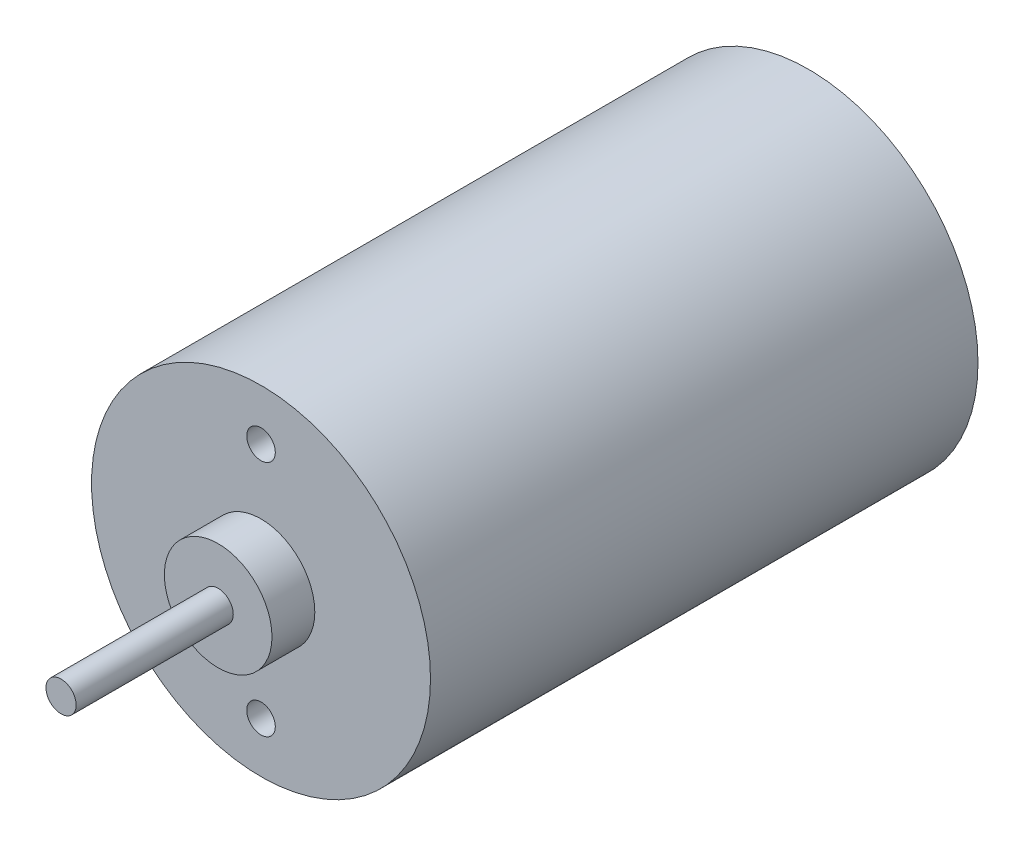
ISO-10303-21;
HEADER;
FILE_DESCRIPTION(('STEP AP214'),'2;1');
FILE_NAME('part.step','',(''),(''),'','','');
FILE_SCHEMA(('AUTOMOTIVE_DESIGN { 1 0 10303 214 1 1 1 1 }'));
ENDSEC;
DATA;
#1=APPLICATION_CONTEXT('core data for automotive mechanical design processes');
#2=APPLICATION_PROTOCOL_DEFINITION('international standard','automotive_design',2000,#1);
#3=PRODUCT_CONTEXT('',#1,'mechanical');
#4=PRODUCT('Part','Part','',(#3));
#5=PRODUCT_RELATED_PRODUCT_CATEGORY('part','',(#4));
#6=PRODUCT_DEFINITION_FORMATION('','',#4);
#7=PRODUCT_DEFINITION_CONTEXT('part definition',#1,'design');
#8=PRODUCT_DEFINITION('design','',#6,#7);
#9=PRODUCT_DEFINITION_SHAPE('','',#8);
#10=(LENGTH_UNIT() NAMED_UNIT(*) SI_UNIT(.MILLI.,.METRE.));
#11=(NAMED_UNIT(*) PLANE_ANGLE_UNIT() SI_UNIT($,.RADIAN.));
#12=(NAMED_UNIT(*) SI_UNIT($,.STERADIAN.) SOLID_ANGLE_UNIT());
#13=UNCERTAINTY_MEASURE_WITH_UNIT(LENGTH_MEASURE(1.E-05),#10,'distance_accuracy_value','');
#14=(GEOMETRIC_REPRESENTATION_CONTEXT(3) GLOBAL_UNCERTAINTY_ASSIGNED_CONTEXT((#13)) GLOBAL_UNIT_ASSIGNED_CONTEXT((#10,
#11,#12)) REPRESENTATION_CONTEXT('',''));
#15=CARTESIAN_POINT('',(0.,0.,0.));
#16=DIRECTION('',(0.,0.,1.));
#17=DIRECTION('',(1.,0.,0.));
#18=AXIS2_PLACEMENT_3D('',#15,#16,#17);
#19=CARTESIAN_POINT('',(0.,0.,57.5));
#20=DIRECTION('',(0.,0.,-1.));
#21=DIRECTION('',(-1.,0.,0.));
#22=AXIS2_PLACEMENT_3D('',#19,#20,#21);
#23=CYLINDRICAL_SURFACE('',#22,17.8);
#24=CARTESIAN_POINT('',(0.,0.,57.5));
#25=DIRECTION('',(0.,0.,1.));
#26=DIRECTION('',(1.,0.,0.));
#27=AXIS2_PLACEMENT_3D('',#24,#25,#26);
#28=CIRCLE('',#27,17.8);
#29=CARTESIAN_POINT('',(17.8,0.,57.5));
#30=VERTEX_POINT('',#29);
#31=EDGE_CURVE('E80',#30,#30,#28,.T.);
#32=ORIENTED_EDGE('',*,*,#31,.F.);
#33=EDGE_LOOP('',(#32));
#34=FACE_BOUND('',#33,.T.);
#35=CARTESIAN_POINT('',(0.,0.,0.));
#36=DIRECTION('',(0.,0.,1.));
#37=DIRECTION('',(1.,0.,0.));
#38=AXIS2_PLACEMENT_3D('',#35,#36,#37);
#39=CIRCLE('',#38,17.8);
#40=CARTESIAN_POINT('',(17.8,0.,0.));
#41=VERTEX_POINT('',#40);
#42=EDGE_CURVE('E40',#41,#41,#39,.T.);
#43=ORIENTED_EDGE('',*,*,#42,.T.);
#44=EDGE_LOOP('',(#43));
#45=FACE_BOUND('',#44,.T.);
#46=ADVANCED_FACE('F37',(#34,#45),#23,.T.);
#47=CARTESIAN_POINT('',(0.,0.,57.5));
#48=DIRECTION('',(0.,0.,1.));
#49=DIRECTION('',(1.,0.,0.));
#50=AXIS2_PLACEMENT_3D('',#47,#48,#49);
#51=PLANE('',#50);
#52=CARTESIAN_POINT('',(0.,12.446,57.5));
#53=DIRECTION('',(0.,0.,1.));
#54=DIRECTION('',(1.,0.,0.));
#55=AXIS2_PLACEMENT_3D('',#52,#53,#54);
#56=CIRCLE('',#55,1.49999999999999);
#57=CARTESIAN_POINT('',(1.49999999999999,12.446,57.5));
#58=VERTEX_POINT('',#57);
#59=EDGE_CURVE('E63',#58,#58,#56,.T.);
#60=ORIENTED_EDGE('',*,*,#59,.F.);
#61=EDGE_LOOP('',(#60));
#62=FACE_BOUND('',#61,.T.);
#63=CARTESIAN_POINT('',(0.,-12.5,57.5));
#64=DIRECTION('',(0.,0.,1.));
#65=DIRECTION('',(1.,0.,0.));
#66=AXIS2_PLACEMENT_3D('',#63,#64,#65);
#67=CIRCLE('',#66,1.49999999999999);
#68=CARTESIAN_POINT('',(1.49999999999999,-12.5,57.5));
#69=VERTEX_POINT('',#68);
#70=EDGE_CURVE('E62',#69,#69,#67,.T.);
#71=ORIENTED_EDGE('',*,*,#70,.F.);
#72=EDGE_LOOP('',(#71));
#73=FACE_BOUND('',#72,.T.);
#74=CARTESIAN_POINT('',(0.,0.,57.5));
#75=DIRECTION('',(0.,0.,1.));
#76=DIRECTION('',(1.,0.,0.));
#77=AXIS2_PLACEMENT_3D('',#74,#75,#76);
#78=CIRCLE('',#77,5.65);
#79=CARTESIAN_POINT('',(5.65,0.,57.5));
#80=VERTEX_POINT('',#79);
#81=EDGE_CURVE('E45',#80,#80,#78,.T.);
#82=ORIENTED_EDGE('',*,*,#81,.F.);
#83=EDGE_LOOP('',(#82));
#84=FACE_BOUND('',#83,.T.);
#85=ORIENTED_EDGE('',*,*,#31,.T.);
#86=EDGE_LOOP('',(#85));
#87=FACE_BOUND('',#86,.T.);
#88=ADVANCED_FACE('F91',(#62,#73,#84,#87),#51,.T.);
#89=CARTESIAN_POINT('',(0.,0.,0.));
#90=DIRECTION('',(0.,0.,1.));
#91=DIRECTION('',(1.,0.,0.));
#92=AXIS2_PLACEMENT_3D('',#89,#90,#91);
#93=PLANE('',#92);
#94=ORIENTED_EDGE('',*,*,#42,.F.);
#95=EDGE_LOOP('',(#94));
#96=FACE_BOUND('',#95,.T.);
#97=ADVANCED_FACE('F88',(#96),#93,.F.);
#98=CARTESIAN_POINT('',(0.,0.,62.));
#99=DIRECTION('',(0.,0.,-1.));
#100=DIRECTION('',(-1.,0.,0.));
#101=AXIS2_PLACEMENT_3D('',#98,#99,#100);
#102=CYLINDRICAL_SURFACE('',#101,5.65);
#103=CARTESIAN_POINT('',(0.,0.,62.));
#104=DIRECTION('',(0.,0.,1.));
#105=DIRECTION('',(1.,0.,0.));
#106=AXIS2_PLACEMENT_3D('',#103,#104,#105);
#107=CIRCLE('',#106,5.65);
#108=CARTESIAN_POINT('',(5.65,0.,62.));
#109=VERTEX_POINT('',#108);
#110=EDGE_CURVE('E75',#109,#109,#107,.T.);
#111=ORIENTED_EDGE('',*,*,#110,.F.);
#112=EDGE_LOOP('',(#111));
#113=FACE_BOUND('',#112,.T.);
#114=ORIENTED_EDGE('',*,*,#81,.T.);
#115=EDGE_LOOP('',(#114));
#116=FACE_BOUND('',#115,.T.);
#117=ADVANCED_FACE('F90',(#113,#116),#102,.T.);
#118=CARTESIAN_POINT('',(0.,0.,62.));
#119=DIRECTION('',(0.,0.,1.));
#120=DIRECTION('',(1.,0.,0.));
#121=AXIS2_PLACEMENT_3D('',#118,#119,#120);
#122=PLANE('',#121);
#123=CARTESIAN_POINT('',(0.,0.,62.));
#124=DIRECTION('',(0.,0.,1.));
#125=DIRECTION('',(1.,0.,0.));
#126=AXIS2_PLACEMENT_3D('',#123,#124,#125);
#127=CIRCLE('',#126,1.585);
#128=CARTESIAN_POINT('',(1.585,0.,62.));
#129=VERTEX_POINT('',#128);
#130=EDGE_CURVE('E11',#129,#129,#127,.T.);
#131=ORIENTED_EDGE('',*,*,#130,.F.);
#132=EDGE_LOOP('',(#131));
#133=FACE_BOUND('',#132,.T.);
#134=ORIENTED_EDGE('',*,*,#110,.T.);
#135=EDGE_LOOP('',(#134));
#136=FACE_BOUND('',#135,.T.);
#137=ADVANCED_FACE('F96',(#133,#136),#122,.T.);
#138=CARTESIAN_POINT('',(0.,0.,78.5));
#139=DIRECTION('',(0.,0.,-1.));
#140=DIRECTION('',(-1.,0.,0.));
#141=AXIS2_PLACEMENT_3D('',#138,#139,#140);
#142=CYLINDRICAL_SURFACE('',#141,1.585);
#143=CARTESIAN_POINT('',(0.,0.,78.5));
#144=DIRECTION('',(0.,0.,1.));
#145=DIRECTION('',(1.,0.,0.));
#146=AXIS2_PLACEMENT_3D('',#143,#144,#145);
#147=CIRCLE('',#146,1.585);
#148=CARTESIAN_POINT('',(1.585,0.,78.5));
#149=VERTEX_POINT('',#148);
#150=EDGE_CURVE('E73',#149,#149,#147,.T.);
#151=ORIENTED_EDGE('',*,*,#150,.F.);
#152=EDGE_LOOP('',(#151));
#153=FACE_BOUND('',#152,.T.);
#154=ORIENTED_EDGE('',*,*,#130,.T.);
#155=EDGE_LOOP('',(#154));
#156=FACE_BOUND('',#155,.T.);
#157=ADVANCED_FACE('F155',(#153,#156),#142,.T.);
#158=CARTESIAN_POINT('',(0.,0.,78.5));
#159=DIRECTION('',(0.,0.,1.));
#160=DIRECTION('',(1.,0.,0.));
#161=AXIS2_PLACEMENT_3D('',#158,#159,#160);
#162=PLANE('',#161);
#163=ORIENTED_EDGE('',*,*,#150,.T.);
#164=EDGE_LOOP('',(#163));
#165=FACE_BOUND('',#164,.T.);
#166=ADVANCED_FACE('F116',(#165),#162,.T.);
#167=CARTESIAN_POINT('',(0.,-12.5,51.15));
#168=DIRECTION('',(0.,0.,1.));
#169=DIRECTION('',(1.,0.,0.));
#170=AXIS2_PLACEMENT_3D('',#167,#168,#169);
#171=CONICAL_SURFACE('',#170,1.5,1.02974425867665);
#172=CARTESIAN_POINT('',(0.,-12.5,50.2487090714587));
#173=VERTEX_POINT('',#172);
#174=VERTEX_LOOP('',#173);
#175=FACE_BOUND('',#174,.T.);
#176=CARTESIAN_POINT('',(0.,-12.5,51.15));
#177=DIRECTION('',(0.,0.,1.));
#178=DIRECTION('',(1.,0.,0.));
#179=AXIS2_PLACEMENT_3D('',#176,#177,#178);
#180=CIRCLE('',#179,1.5);
#181=CARTESIAN_POINT('',(1.5,-12.5,51.15));
#182=VERTEX_POINT('',#181);
#183=EDGE_CURVE('E66',#182,#182,#180,.T.);
#184=ORIENTED_EDGE('',*,*,#183,.T.);
#185=EDGE_LOOP('',(#184));
#186=FACE_BOUND('',#185,.T.);
#187=ADVANCED_FACE('F121',(#175,#186),#171,.F.);
#188=CARTESIAN_POINT('',(0.,-12.5,57.5));
#189=DIRECTION('',(0.,0.,1.));
#190=DIRECTION('',(1.,0.,0.));
#191=AXIS2_PLACEMENT_3D('',#188,#189,#190);
#192=CYLINDRICAL_SURFACE('',#191,1.49999999999999);
#193=ORIENTED_EDGE('',*,*,#183,.F.);
#194=EDGE_LOOP('',(#193));
#195=FACE_BOUND('',#194,.T.);
#196=ORIENTED_EDGE('',*,*,#70,.T.);
#197=EDGE_LOOP('',(#196));
#198=FACE_BOUND('',#197,.T.);
#199=ADVANCED_FACE('F56',(#195,#198),#192,.F.);
#200=CARTESIAN_POINT('',(0.,12.446,51.15));
#201=DIRECTION('',(0.,0.,1.));
#202=DIRECTION('',(1.,0.,0.));
#203=AXIS2_PLACEMENT_3D('',#200,#201,#202);
#204=CONICAL_SURFACE('',#203,1.5,1.02974425867665);
#205=CARTESIAN_POINT('',(0.,12.446,50.2487090714587));
#206=VERTEX_POINT('',#205);
#207=VERTEX_LOOP('',#206);
#208=FACE_BOUND('',#207,.T.);
#209=CARTESIAN_POINT('',(0.,12.446,51.15));
#210=DIRECTION('',(0.,0.,1.));
#211=DIRECTION('',(1.,0.,0.));
#212=AXIS2_PLACEMENT_3D('',#209,#210,#211);
#213=CIRCLE('',#212,1.5);
#214=CARTESIAN_POINT('',(1.5,12.446,51.15));
#215=VERTEX_POINT('',#214);
#216=EDGE_CURVE('E60',#215,#215,#213,.T.);
#217=ORIENTED_EDGE('',*,*,#216,.T.);
#218=EDGE_LOOP('',(#217));
#219=FACE_BOUND('',#218,.T.);
#220=ADVANCED_FACE('F52',(#208,#219),#204,.F.);
#221=CARTESIAN_POINT('',(0.,12.446,57.5));
#222=DIRECTION('',(0.,0.,1.));
#223=DIRECTION('',(1.,0.,0.));
#224=AXIS2_PLACEMENT_3D('',#221,#222,#223);
#225=CYLINDRICAL_SURFACE('',#224,1.49999999999999);
#226=ORIENTED_EDGE('',*,*,#216,.F.);
#227=EDGE_LOOP('',(#226));
#228=FACE_BOUND('',#227,.T.);
#229=ORIENTED_EDGE('',*,*,#59,.T.);
#230=EDGE_LOOP('',(#229));
#231=FACE_BOUND('',#230,.T.);
#232=ADVANCED_FACE('F55',(#228,#231),#225,.F.);
#233=CLOSED_SHELL('',(#46,#88,#97,#117,#137,#157,#166,#187,#199,#220,#232));
#234=MANIFOLD_SOLID_BREP('B2',#233);
#235=ADVANCED_BREP_SHAPE_REPRESENTATION('',(#18,#234),#14);
#236=SHAPE_DEFINITION_REPRESENTATION(#9,#235);
ENDSEC;
END-ISO-10303-21;
